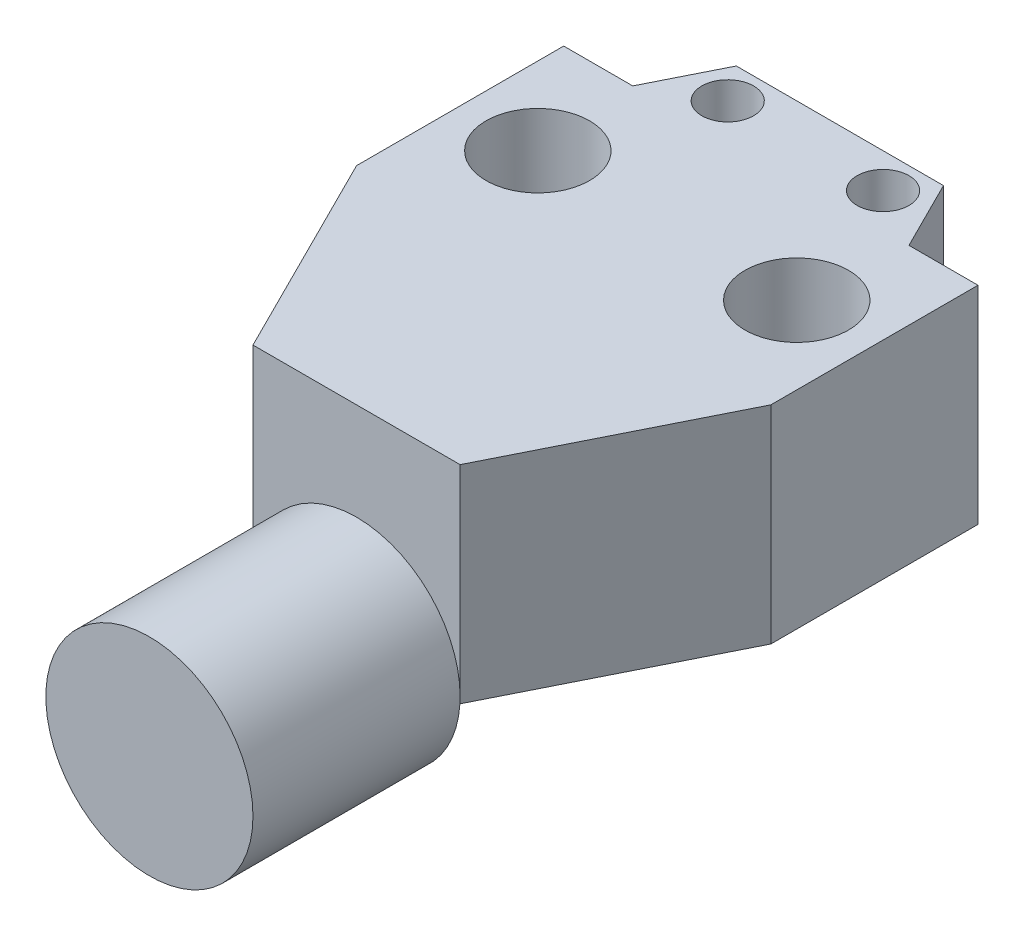
ISO-10303-21;
HEADER;
FILE_DESCRIPTION(('STEP AP214'),'2;1');
FILE_NAME('part.step','',(''),(''),'','','');
FILE_SCHEMA(('AUTOMOTIVE_DESIGN { 1 0 10303 214 1 1 1 1 }'));
ENDSEC;
DATA;
#1=APPLICATION_CONTEXT('core data for automotive mechanical design processes');
#2=APPLICATION_PROTOCOL_DEFINITION('international standard','automotive_design',2000,#1);
#3=PRODUCT_CONTEXT('',#1,'mechanical');
#4=PRODUCT('Part','Part','',(#3));
#5=PRODUCT_RELATED_PRODUCT_CATEGORY('part','',(#4));
#6=PRODUCT_DEFINITION_FORMATION('','',#4);
#7=PRODUCT_DEFINITION_CONTEXT('part definition',#1,'design');
#8=PRODUCT_DEFINITION('design','',#6,#7);
#9=PRODUCT_DEFINITION_SHAPE('','',#8);
#10=(LENGTH_UNIT() NAMED_UNIT(*) SI_UNIT(.MILLI.,.METRE.));
#11=(NAMED_UNIT(*) PLANE_ANGLE_UNIT() SI_UNIT($,.RADIAN.));
#12=(NAMED_UNIT(*) SI_UNIT($,.STERADIAN.) SOLID_ANGLE_UNIT());
#13=UNCERTAINTY_MEASURE_WITH_UNIT(LENGTH_MEASURE(1.E-05),#10,'distance_accuracy_value','');
#14=(GEOMETRIC_REPRESENTATION_CONTEXT(3) GLOBAL_UNCERTAINTY_ASSIGNED_CONTEXT((#13)) GLOBAL_UNIT_ASSIGNED_CONTEXT((#10,
#11,#12)) REPRESENTATION_CONTEXT('',''));
#15=CARTESIAN_POINT('',(0.,0.,0.));
#16=DIRECTION('',(0.,0.,1.));
#17=DIRECTION('',(1.,0.,0.));
#18=AXIS2_PLACEMENT_3D('',#15,#16,#17);
#19=CARTESIAN_POINT('',(-79.375,158.75,238.125));
#20=DIRECTION('',(0.,0.,-1.));
#21=DIRECTION('',(-1.,0.,0.));
#22=AXIS2_PLACEMENT_3D('',#19,#20,#21);
#23=PLANE('',#22);
#24=CARTESIAN_POINT('',(0.,4.84230637468058,238.125));
#25=DIRECTION('',(0.,0.,1.));
#26=DIRECTION('',(1.,0.,0.));
#27=AXIS2_PLACEMENT_3D('',#24,#25,#26);
#28=CIRCLE('',#27,79.375);
#29=CARTESIAN_POINT('',(-79.375,4.84230637468058,238.125));
#30=VERTEX_POINT('',#29);
#31=CARTESIAN_POINT('',(-79.2271588154827,0.,238.125));
#32=VERTEX_POINT('',#31);
#33=EDGE_CURVE('E11',#30,#32,#28,.T.);
#34=ORIENTED_EDGE('',*,*,#33,.F.);
#35=DIRECTION('',(0.,-1.,0.));
#36=VECTOR('',#35,1.);
#37=CARTESIAN_POINT('',(-79.375,158.75,238.125));
#38=LINE('',#37,#36);
#39=CARTESIAN_POINT('',(-79.375,0.,238.125));
#40=VERTEX_POINT('',#39);
#41=EDGE_CURVE('E141',#30,#40,#38,.T.);
#42=ORIENTED_EDGE('',*,*,#41,.T.);
#43=DIRECTION('',(1.,0.,0.));
#44=VECTOR('',#43,1.);
#45=CARTESIAN_POINT('',(-79.375,0.,238.125));
#46=LINE('',#45,#44);
#47=EDGE_CURVE('E254',#40,#32,#46,.T.);
#48=ORIENTED_EDGE('',*,*,#47,.T.);
#49=EDGE_LOOP('',(#34,#42,#48));
#50=FACE_BOUND('',#49,.T.);
#51=ADVANCED_FACE('F39',(#50),#23,.F.);
#52=CARTESIAN_POINT('',(79.375,4.84230637468058,238.125));
#53=VERTEX_POINT('',#52);
#54=EDGE_CURVE('E150',#53,#30,#28,.T.);
#55=ORIENTED_EDGE('',*,*,#54,.F.);
#56=DIRECTION('',(0.,-1.,0.));
#57=VECTOR('',#56,1.);
#58=CARTESIAN_POINT('',(79.375,158.75,238.125));
#59=LINE('',#58,#57);
#60=CARTESIAN_POINT('',(79.375,158.75,238.125));
#61=VERTEX_POINT('',#60);
#62=EDGE_CURVE('E132',#61,#53,#59,.T.);
#63=ORIENTED_EDGE('',*,*,#62,.F.);
#64=DIRECTION('',(1.,0.,0.));
#65=VECTOR('',#64,1.);
#66=CARTESIAN_POINT('',(-79.375,158.75,238.125));
#67=LINE('',#66,#65);
#68=CARTESIAN_POINT('',(-79.375,158.75,238.125));
#69=VERTEX_POINT('',#68);
#70=EDGE_CURVE('E222',#69,#61,#67,.T.);
#71=ORIENTED_EDGE('',*,*,#70,.F.);
#72=EDGE_CURVE('E153',#69,#30,#38,.T.);
#73=ORIENTED_EDGE('',*,*,#72,.T.);
#74=EDGE_LOOP('',(#55,#63,#71,#73));
#75=FACE_BOUND('',#74,.T.);
#76=ADVANCED_FACE('F151',(#75),#23,.F.);
#77=CARTESIAN_POINT('',(0.,158.75,0.));
#78=DIRECTION('',(0.,1.,0.));
#79=DIRECTION('',(0.,0.,1.));
#80=AXIS2_PLACEMENT_3D('',#77,#78,#79);
#81=PLANE('',#80);
#82=CARTESIAN_POINT('',(-59.53125,158.75,-105.833333333333));
#83=DIRECTION('',(0.,1.,0.));
#84=DIRECTION('',(0.,0.,1.));
#85=AXIS2_PLACEMENT_3D('',#82,#83,#84);
#86=CIRCLE('',#85,19.84375);
#87=CARTESIAN_POINT('',(-59.53125,158.75,-125.677083333333));
#88=VERTEX_POINT('',#87);
#89=EDGE_CURVE('E175',#88,#88,#86,.T.);
#90=ORIENTED_EDGE('',*,*,#89,.F.);
#91=EDGE_LOOP('',(#90));
#92=FACE_BOUND('',#91,.T.);
#93=CARTESIAN_POINT('',(-99.21875,158.75,0.));
#94=DIRECTION('',(0.,1.,0.));
#95=DIRECTION('',(0.,0.,1.));
#96=AXIS2_PLACEMENT_3D('',#93,#94,#95);
#97=CIRCLE('',#96,39.6875);
#98=CARTESIAN_POINT('',(-99.21875,158.75,-39.6875));
#99=VERTEX_POINT('',#98);
#100=EDGE_CURVE('E191',#99,#99,#97,.T.);
#101=ORIENTED_EDGE('',*,*,#100,.F.);
#102=EDGE_LOOP('',(#101));
#103=FACE_BOUND('',#102,.T.);
#104=DIRECTION('',(-1.,0.,0.));
#105=VECTOR('',#104,1.);
#106=CARTESIAN_POINT('',(105.833333333333,158.75,-79.375));
#107=LINE('',#106,#105);
#108=CARTESIAN_POINT('',(158.75,158.75,-79.375));
#109=VERTEX_POINT('',#108);
#110=CARTESIAN_POINT('',(105.833333333333,158.75,-79.375));
#111=VERTEX_POINT('',#110);
#112=EDGE_CURVE('E199',#109,#111,#107,.T.);
#113=ORIENTED_EDGE('',*,*,#112,.T.);
#114=DIRECTION('',(-0.447213595499958,0.,-0.894427190999916));
#115=VECTOR('',#114,1.);
#116=CARTESIAN_POINT('',(79.375,158.75,-132.291666666667));
#117=LINE('',#116,#115);
#118=CARTESIAN_POINT('',(79.375,158.75,-132.291666666667));
#119=VERTEX_POINT('',#118);
#120=EDGE_CURVE('E203',#111,#119,#117,.T.);
#121=ORIENTED_EDGE('',*,*,#120,.T.);
#122=DIRECTION('',(-1.,0.,0.));
#123=VECTOR('',#122,1.);
#124=CARTESIAN_POINT('',(79.375,158.75,-132.291666666667));
#125=LINE('',#124,#123);
#126=CARTESIAN_POINT('',(-79.375,158.75,-132.291666666667));
#127=VERTEX_POINT('',#126);
#128=EDGE_CURVE('E207',#119,#127,#125,.T.);
#129=ORIENTED_EDGE('',*,*,#128,.T.);
#130=DIRECTION('',(-0.447213595499959,0.,0.894427190999915));
#131=VECTOR('',#130,1.);
#132=CARTESIAN_POINT('',(-105.833333333333,158.75,-79.375));
#133=LINE('',#132,#131);
#134=CARTESIAN_POINT('',(-105.833333333333,158.75,-79.375));
#135=VERTEX_POINT('',#134);
#136=EDGE_CURVE('E210',#127,#135,#133,.T.);
#137=ORIENTED_EDGE('',*,*,#136,.T.);
#138=DIRECTION('',(-1.,0.,0.));
#139=VECTOR('',#138,1.);
#140=CARTESIAN_POINT('',(-158.75,158.75,-79.375));
#141=LINE('',#140,#139);
#142=CARTESIAN_POINT('',(-158.75,158.75,-79.375));
#143=VERTEX_POINT('',#142);
#144=EDGE_CURVE('E213',#135,#143,#141,.T.);
#145=ORIENTED_EDGE('',*,*,#144,.T.);
#146=DIRECTION('',(0.,0.,1.));
#147=VECTOR('',#146,1.);
#148=CARTESIAN_POINT('',(-158.75,158.75,79.375));
#149=LINE('',#148,#147);
#150=CARTESIAN_POINT('',(-158.75,158.75,79.375));
#151=VERTEX_POINT('',#150);
#152=EDGE_CURVE('E216',#143,#151,#149,.T.);
#153=ORIENTED_EDGE('',*,*,#152,.T.);
#154=DIRECTION('',(0.447213595499958,0.,0.894427190999916));
#155=VECTOR('',#154,1.);
#156=CARTESIAN_POINT('',(-158.75,158.75,79.375));
#157=LINE('',#156,#155);
#158=EDGE_CURVE('E219',#151,#69,#157,.T.);
#159=ORIENTED_EDGE('',*,*,#158,.T.);
#160=ORIENTED_EDGE('',*,*,#70,.T.);
#161=DIRECTION('',(0.447213595499958,0.,-0.894427190999916));
#162=VECTOR('',#161,1.);
#163=CARTESIAN_POINT('',(158.75,158.75,79.375));
#164=LINE('',#163,#162);
#165=CARTESIAN_POINT('',(158.75,158.75,79.375));
#166=VERTEX_POINT('',#165);
#167=EDGE_CURVE('E136',#61,#166,#164,.T.);
#168=ORIENTED_EDGE('',*,*,#167,.T.);
#169=DIRECTION('',(0.,0.,-1.));
#170=VECTOR('',#169,1.);
#171=CARTESIAN_POINT('',(158.75,158.75,79.375));
#172=LINE('',#171,#170);
#173=EDGE_CURVE('E227',#166,#109,#172,.T.);
#174=ORIENTED_EDGE('',*,*,#173,.T.);
#175=EDGE_LOOP('',(#113,#121,#129,#137,#145,#153,#159,#160,#168,#174));
#176=FACE_BOUND('',#175,.T.);
#177=CARTESIAN_POINT('',(99.21875,158.75,0.));
#178=DIRECTION('',(0.,1.,0.));
#179=DIRECTION('',(0.,0.,1.));
#180=AXIS2_PLACEMENT_3D('',#177,#178,#179);
#181=CIRCLE('',#180,39.6875);
#182=CARTESIAN_POINT('',(99.21875,158.75,-39.6875));
#183=VERTEX_POINT('',#182);
#184=EDGE_CURVE('E183',#183,#183,#181,.T.);
#185=ORIENTED_EDGE('',*,*,#184,.F.);
#186=EDGE_LOOP('',(#185));
#187=FACE_BOUND('',#186,.T.);
#188=CARTESIAN_POINT('',(59.53125,158.75,-105.833333333333));
#189=DIRECTION('',(0.,1.,0.));
#190=DIRECTION('',(0.,0.,1.));
#191=AXIS2_PLACEMENT_3D('',#188,#189,#190);
#192=CIRCLE('',#191,19.84375);
#193=CARTESIAN_POINT('',(59.53125,158.75,-125.677083333333));
#194=VERTEX_POINT('',#193);
#195=EDGE_CURVE('E166',#194,#194,#192,.T.);
#196=ORIENTED_EDGE('',*,*,#195,.F.);
#197=EDGE_LOOP('',(#196));
#198=FACE_BOUND('',#197,.T.);
#199=ADVANCED_FACE('F314',(#92,#103,#176,#187,#198),#81,.T.);
#200=CARTESIAN_POINT('',(0.,0.,0.));
#201=DIRECTION('',(0.,1.,0.));
#202=DIRECTION('',(0.,0.,1.));
#203=AXIS2_PLACEMENT_3D('',#200,#201,#202);
#204=PLANE('',#203);
#205=DIRECTION('',(-1.,0.,0.));
#206=VECTOR('',#205,1.);
#207=CARTESIAN_POINT('',(105.833333333333,0.,-79.375));
#208=LINE('',#207,#206);
#209=CARTESIAN_POINT('',(158.75,0.,-79.375));
#210=VERTEX_POINT('',#209);
#211=CARTESIAN_POINT('',(105.833333333333,0.,-79.375));
#212=VERTEX_POINT('',#211);
#213=EDGE_CURVE('E195',#210,#212,#208,.T.);
#214=ORIENTED_EDGE('',*,*,#213,.F.);
#215=DIRECTION('',(0.,0.,-1.));
#216=VECTOR('',#215,1.);
#217=CARTESIAN_POINT('',(158.75,0.,79.375));
#218=LINE('',#217,#216);
#219=CARTESIAN_POINT('',(158.75,0.,79.375));
#220=VERTEX_POINT('',#219);
#221=EDGE_CURVE('E204',#220,#210,#218,.T.);
#222=ORIENTED_EDGE('',*,*,#221,.F.);
#223=DIRECTION('',(0.447213595499958,0.,-0.894427190999916));
#224=VECTOR('',#223,1.);
#225=CARTESIAN_POINT('',(158.75,0.,79.375));
#226=LINE('',#225,#224);
#227=CARTESIAN_POINT('',(79.375,0.,238.125));
#228=VERTEX_POINT('',#227);
#229=EDGE_CURVE('E257',#228,#220,#226,.T.);
#230=ORIENTED_EDGE('',*,*,#229,.F.);
#231=CARTESIAN_POINT('',(79.2271588154827,0.,238.125));
#232=VERTEX_POINT('',#231);
#233=EDGE_CURVE('E144',#232,#228,#46,.T.);
#234=ORIENTED_EDGE('',*,*,#233,.F.);
#235=EDGE_CURVE('E258',#32,#232,#46,.T.);
#236=ORIENTED_EDGE('',*,*,#235,.F.);
#237=ORIENTED_EDGE('',*,*,#47,.F.);
#238=DIRECTION('',(0.447213595499958,0.,0.894427190999916));
#239=VECTOR('',#238,1.);
#240=CARTESIAN_POINT('',(-158.75,0.,79.375));
#241=LINE('',#240,#239);
#242=CARTESIAN_POINT('',(-158.75,0.,79.375));
#243=VERTEX_POINT('',#242);
#244=EDGE_CURVE('E250',#243,#40,#241,.T.);
#245=ORIENTED_EDGE('',*,*,#244,.F.);
#246=DIRECTION('',(0.,0.,1.));
#247=VECTOR('',#246,1.);
#248=CARTESIAN_POINT('',(-158.75,0.,79.375));
#249=LINE('',#248,#247);
#250=CARTESIAN_POINT('',(-158.75,0.,-79.375));
#251=VERTEX_POINT('',#250);
#252=EDGE_CURVE('E247',#251,#243,#249,.T.);
#253=ORIENTED_EDGE('',*,*,#252,.F.);
#254=DIRECTION('',(-1.,0.,0.));
#255=VECTOR('',#254,1.);
#256=CARTESIAN_POINT('',(-158.75,0.,-79.375));
#257=LINE('',#256,#255);
#258=CARTESIAN_POINT('',(-105.833333333333,0.,-79.375));
#259=VERTEX_POINT('',#258);
#260=EDGE_CURVE('E244',#259,#251,#257,.T.);
#261=ORIENTED_EDGE('',*,*,#260,.F.);
#262=DIRECTION('',(-0.447213595499959,0.,0.894427190999915));
#263=VECTOR('',#262,1.);
#264=CARTESIAN_POINT('',(-105.833333333333,0.,-79.375));
#265=LINE('',#264,#263);
#266=CARTESIAN_POINT('',(-79.375,0.,-132.291666666667));
#267=VERTEX_POINT('',#266);
#268=EDGE_CURVE('E241',#267,#259,#265,.T.);
#269=ORIENTED_EDGE('',*,*,#268,.F.);
#270=DIRECTION('',(-1.,0.,0.));
#271=VECTOR('',#270,1.);
#272=CARTESIAN_POINT('',(0.,0.,-132.291666666667));
#273=LINE('',#272,#271);
#274=CARTESIAN_POINT('',(79.375,0.,-132.291666666667));
#275=VERTEX_POINT('',#274);
#276=EDGE_CURVE('E238',#275,#267,#273,.T.);
#277=ORIENTED_EDGE('',*,*,#276,.F.);
#278=DIRECTION('',(-0.447213595499958,0.,-0.894427190999916));
#279=VECTOR('',#278,1.);
#280=CARTESIAN_POINT('',(79.375,0.,-132.291666666667));
#281=LINE('',#280,#279);
#282=EDGE_CURVE('E234',#212,#275,#281,.T.);
#283=ORIENTED_EDGE('',*,*,#282,.F.);
#284=EDGE_LOOP('',(#214,#222,#230,#234,#236,#237,#245,#253,#261,#269,#277,#283));
#285=FACE_BOUND('',#284,.T.);
#286=CARTESIAN_POINT('',(-99.21875,0.,0.));
#287=DIRECTION('',(0.,1.,0.));
#288=DIRECTION('',(0.,0.,1.));
#289=AXIS2_PLACEMENT_3D('',#286,#287,#288);
#290=CIRCLE('',#289,39.6875);
#291=CARTESIAN_POINT('',(-99.21875,0.,-39.6875));
#292=VERTEX_POINT('',#291);
#293=EDGE_CURVE('E187',#292,#292,#290,.T.);
#294=ORIENTED_EDGE('',*,*,#293,.T.);
#295=EDGE_LOOP('',(#294));
#296=FACE_BOUND('',#295,.T.);
#297=CARTESIAN_POINT('',(99.21875,0.,0.));
#298=DIRECTION('',(0.,1.,0.));
#299=DIRECTION('',(0.,0.,1.));
#300=AXIS2_PLACEMENT_3D('',#297,#298,#299);
#301=CIRCLE('',#300,39.6875);
#302=CARTESIAN_POINT('',(99.21875,0.,-39.6875));
#303=VERTEX_POINT('',#302);
#304=EDGE_CURVE('E179',#303,#303,#301,.T.);
#305=ORIENTED_EDGE('',*,*,#304,.T.);
#306=EDGE_LOOP('',(#305));
#307=FACE_BOUND('',#306,.T.);
#308=CARTESIAN_POINT('',(-59.53125,0.,-105.833333333333));
#309=DIRECTION('',(0.,1.,0.));
#310=DIRECTION('',(0.,0.,1.));
#311=AXIS2_PLACEMENT_3D('',#308,#309,#310);
#312=CIRCLE('',#311,19.84375);
#313=CARTESIAN_POINT('',(-59.53125,0.,-125.677083333333));
#314=VERTEX_POINT('',#313);
#315=EDGE_CURVE('E170',#314,#314,#312,.T.);
#316=ORIENTED_EDGE('',*,*,#315,.T.);
#317=EDGE_LOOP('',(#316));
#318=FACE_BOUND('',#317,.T.);
#319=CARTESIAN_POINT('',(59.53125,0.,-105.833333333333));
#320=DIRECTION('',(0.,1.,0.));
#321=DIRECTION('',(0.,0.,1.));
#322=AXIS2_PLACEMENT_3D('',#319,#320,#321);
#323=CIRCLE('',#322,19.84375);
#324=CARTESIAN_POINT('',(59.53125,0.,-125.677083333333));
#325=VERTEX_POINT('',#324);
#326=EDGE_CURVE('E171',#325,#325,#323,.T.);
#327=ORIENTED_EDGE('',*,*,#326,.T.);
#328=EDGE_LOOP('',(#327));
#329=FACE_BOUND('',#328,.T.);
#330=ADVANCED_FACE('F298',(#285,#296,#307,#318,#329),#204,.F.);
#331=CARTESIAN_POINT('',(105.833333333333,158.75,-79.375));
#332=DIRECTION('',(0.,0.,1.));
#333=DIRECTION('',(1.,0.,0.));
#334=AXIS2_PLACEMENT_3D('',#331,#332,#333);
#335=PLANE('',#334);
#336=ORIENTED_EDGE('',*,*,#213,.T.);
#337=DIRECTION('',(0.,-1.,0.));
#338=VECTOR('',#337,1.);
#339=CARTESIAN_POINT('',(105.833333333333,158.75,-79.375));
#340=LINE('',#339,#338);
#341=EDGE_CURVE('E43',#111,#212,#340,.T.);
#342=ORIENTED_EDGE('',*,*,#341,.F.);
#343=ORIENTED_EDGE('',*,*,#112,.F.);
#344=DIRECTION('',(0.,-1.,0.));
#345=VECTOR('',#344,1.);
#346=CARTESIAN_POINT('',(158.75,158.75,-79.375));
#347=LINE('',#346,#345);
#348=EDGE_CURVE('E230',#109,#210,#347,.T.);
#349=ORIENTED_EDGE('',*,*,#348,.T.);
#350=EDGE_LOOP('',(#336,#342,#343,#349));
#351=FACE_BOUND('',#350,.T.);
#352=ADVANCED_FACE('F41',(#351),#335,.F.);
#353=CARTESIAN_POINT('',(79.375,158.75,-132.291666666667));
#354=DIRECTION('',(-0.894427190999916,0.,0.447213595499958));
#355=DIRECTION('',(0.447213595499958,0.,0.894427190999916));
#356=AXIS2_PLACEMENT_3D('',#353,#354,#355);
#357=PLANE('',#356);
#358=ORIENTED_EDGE('',*,*,#282,.T.);
#359=DIRECTION('',(0.,-1.,0.));
#360=VECTOR('',#359,1.);
#361=CARTESIAN_POINT('',(79.375,158.75,-132.291666666667));
#362=LINE('',#361,#360);
#363=EDGE_CURVE('E163',#119,#275,#362,.T.);
#364=ORIENTED_EDGE('',*,*,#363,.F.);
#365=ORIENTED_EDGE('',*,*,#120,.F.);
#366=ORIENTED_EDGE('',*,*,#341,.T.);
#367=EDGE_LOOP('',(#358,#364,#365,#366));
#368=FACE_BOUND('',#367,.T.);
#369=ADVANCED_FACE('F294',(#368),#357,.F.);
#370=CARTESIAN_POINT('',(0.,158.75,-132.291666666667));
#371=DIRECTION('',(0.,0.,1.));
#372=DIRECTION('',(1.,0.,0.));
#373=AXIS2_PLACEMENT_3D('',#370,#371,#372);
#374=PLANE('',#373);
#375=ORIENTED_EDGE('',*,*,#276,.T.);
#376=DIRECTION('',(0.,-1.,0.));
#377=VECTOR('',#376,1.);
#378=CARTESIAN_POINT('',(-79.375,158.75,-132.291666666667));
#379=LINE('',#378,#377);
#380=EDGE_CURVE('E283',#127,#267,#379,.T.);
#381=ORIENTED_EDGE('',*,*,#380,.F.);
#382=ORIENTED_EDGE('',*,*,#128,.F.);
#383=ORIENTED_EDGE('',*,*,#363,.T.);
#384=EDGE_LOOP('',(#375,#381,#382,#383));
#385=FACE_BOUND('',#384,.T.);
#386=ADVANCED_FACE('F291',(#385),#374,.F.);
#387=CARTESIAN_POINT('',(-105.833333333333,158.75,-79.375));
#388=DIRECTION('',(0.894427190999915,0.,0.447213595499959));
#389=DIRECTION('',(0.447213595499959,0.,-0.894427190999916));
#390=AXIS2_PLACEMENT_3D('',#387,#388,#389);
#391=PLANE('',#390);
#392=ORIENTED_EDGE('',*,*,#268,.T.);
#393=DIRECTION('',(0.,-1.,0.));
#394=VECTOR('',#393,1.);
#395=CARTESIAN_POINT('',(-105.833333333333,158.75,-79.375));
#396=LINE('',#395,#394);
#397=EDGE_CURVE('E279',#135,#259,#396,.T.);
#398=ORIENTED_EDGE('',*,*,#397,.F.);
#399=ORIENTED_EDGE('',*,*,#136,.F.);
#400=ORIENTED_EDGE('',*,*,#380,.T.);
#401=EDGE_LOOP('',(#392,#398,#399,#400));
#402=FACE_BOUND('',#401,.T.);
#403=ADVANCED_FACE('F306',(#402),#391,.F.);
#404=CARTESIAN_POINT('',(-158.75,158.75,-79.375));
#405=DIRECTION('',(0.,0.,1.));
#406=DIRECTION('',(1.,0.,0.));
#407=AXIS2_PLACEMENT_3D('',#404,#405,#406);
#408=PLANE('',#407);
#409=ORIENTED_EDGE('',*,*,#260,.T.);
#410=DIRECTION('',(0.,-1.,0.));
#411=VECTOR('',#410,1.);
#412=CARTESIAN_POINT('',(-158.75,158.75,-79.375));
#413=LINE('',#412,#411);
#414=EDGE_CURVE('E275',#143,#251,#413,.T.);
#415=ORIENTED_EDGE('',*,*,#414,.F.);
#416=ORIENTED_EDGE('',*,*,#144,.F.);
#417=ORIENTED_EDGE('',*,*,#397,.T.);
#418=EDGE_LOOP('',(#409,#415,#416,#417));
#419=FACE_BOUND('',#418,.T.);
#420=ADVANCED_FACE('F310',(#419),#408,.F.);
#421=CARTESIAN_POINT('',(-158.75,158.75,79.375));
#422=DIRECTION('',(1.,0.,0.));
#423=DIRECTION('',(0.,0.,-1.));
#424=AXIS2_PLACEMENT_3D('',#421,#422,#423);
#425=PLANE('',#424);
#426=ORIENTED_EDGE('',*,*,#252,.T.);
#427=DIRECTION('',(0.,-1.,0.));
#428=VECTOR('',#427,1.);
#429=CARTESIAN_POINT('',(-158.75,158.75,79.375));
#430=LINE('',#429,#428);
#431=EDGE_CURVE('E271',#151,#243,#430,.T.);
#432=ORIENTED_EDGE('',*,*,#431,.F.);
#433=ORIENTED_EDGE('',*,*,#152,.F.);
#434=ORIENTED_EDGE('',*,*,#414,.T.);
#435=EDGE_LOOP('',(#426,#432,#433,#434));
#436=FACE_BOUND('',#435,.T.);
#437=ADVANCED_FACE('F359',(#436),#425,.F.);
#438=CARTESIAN_POINT('',(-158.75,158.75,79.375));
#439=DIRECTION('',(0.894427190999916,0.,-0.447213595499958));
#440=DIRECTION('',(-0.447213595499958,0.,-0.894427190999916));
#441=AXIS2_PLACEMENT_3D('',#438,#439,#440);
#442=PLANE('',#441);
#443=ORIENTED_EDGE('',*,*,#244,.T.);
#444=ORIENTED_EDGE('',*,*,#41,.F.);
#445=ORIENTED_EDGE('',*,*,#72,.F.);
#446=ORIENTED_EDGE('',*,*,#158,.F.);
#447=ORIENTED_EDGE('',*,*,#431,.T.);
#448=EDGE_LOOP('',(#443,#444,#445,#446,#447));
#449=FACE_BOUND('',#448,.T.);
#450=ADVANCED_FACE('F354',(#449),#442,.F.);
#451=EDGE_CURVE('E49',#232,#53,#28,.T.);
#452=ORIENTED_EDGE('',*,*,#451,.F.);
#453=ORIENTED_EDGE('',*,*,#233,.T.);
#454=EDGE_CURVE('E134',#53,#228,#59,.T.);
#455=ORIENTED_EDGE('',*,*,#454,.F.);
#456=EDGE_LOOP('',(#452,#453,#455));
#457=FACE_BOUND('',#456,.T.);
#458=ADVANCED_FACE('F143',(#457),#23,.F.);
#459=CARTESIAN_POINT('',(158.75,158.75,79.375));
#460=DIRECTION('',(-0.894427190999916,0.,-0.447213595499958));
#461=DIRECTION('',(-0.447213595499958,0.,0.894427190999916));
#462=AXIS2_PLACEMENT_3D('',#459,#460,#461);
#463=PLANE('',#462);
#464=ORIENTED_EDGE('',*,*,#229,.T.);
#465=DIRECTION('',(0.,-1.,0.));
#466=VECTOR('',#465,1.);
#467=CARTESIAN_POINT('',(158.75,158.75,79.375));
#468=LINE('',#467,#466);
#469=EDGE_CURVE('E147',#166,#220,#468,.T.);
#470=ORIENTED_EDGE('',*,*,#469,.F.);
#471=ORIENTED_EDGE('',*,*,#167,.F.);
#472=ORIENTED_EDGE('',*,*,#62,.T.);
#473=ORIENTED_EDGE('',*,*,#454,.T.);
#474=EDGE_LOOP('',(#464,#470,#471,#472,#473));
#475=FACE_BOUND('',#474,.T.);
#476=ADVANCED_FACE('F133',(#475),#463,.F.);
#477=CARTESIAN_POINT('',(158.75,158.75,79.375));
#478=DIRECTION('',(-1.,0.,0.));
#479=DIRECTION('',(0.,0.,1.));
#480=AXIS2_PLACEMENT_3D('',#477,#478,#479);
#481=PLANE('',#480);
#482=ORIENTED_EDGE('',*,*,#221,.T.);
#483=ORIENTED_EDGE('',*,*,#348,.F.);
#484=ORIENTED_EDGE('',*,*,#173,.F.);
#485=ORIENTED_EDGE('',*,*,#469,.T.);
#486=EDGE_LOOP('',(#482,#483,#484,#485));
#487=FACE_BOUND('',#486,.T.);
#488=ADVANCED_FACE('F322',(#487),#481,.F.);
#489=CARTESIAN_POINT('',(-99.21875,158.75,0.));
#490=DIRECTION('',(0.,-1.,0.));
#491=DIRECTION('',(0.,0.,-1.));
#492=AXIS2_PLACEMENT_3D('',#489,#490,#491);
#493=CYLINDRICAL_SURFACE('',#492,39.6875);
#494=CARTESIAN_POINT('',(-99.21875,158.75,-39.6875));
#495=CARTESIAN_POINT('',(-99.21875,157.096354166667,-39.6875));
#496=CARTESIAN_POINT('',(-99.21875,155.442708333333,-39.6875));
#497=CARTESIAN_POINT('',(-99.21875,152.135416666667,-39.6875));
#498=CARTESIAN_POINT('',(-99.21875,150.481770833333,-39.6875));
#499=CARTESIAN_POINT('',(-99.21875,147.174479166667,-39.6875));
#500=CARTESIAN_POINT('',(-99.21875,145.520833333333,-39.6875));
#501=CARTESIAN_POINT('',(-99.21875,142.213541666667,-39.6875));
#502=CARTESIAN_POINT('',(-99.21875,140.559895833333,-39.6875));
#503=CARTESIAN_POINT('',(-99.21875,137.252604166667,-39.6875));
#504=CARTESIAN_POINT('',(-99.21875,135.598958333333,-39.6875));
#505=CARTESIAN_POINT('',(-99.21875,132.291666666667,-39.6875));
#506=CARTESIAN_POINT('',(-99.21875,130.638020833333,-39.6875));
#507=CARTESIAN_POINT('',(-99.21875,127.330729166667,-39.6875));
#508=CARTESIAN_POINT('',(-99.21875,125.677083333333,-39.6875));
#509=CARTESIAN_POINT('',(-99.21875,122.369791666667,-39.6875));
#510=CARTESIAN_POINT('',(-99.21875,120.716145833333,-39.6875));
#511=CARTESIAN_POINT('',(-99.21875,117.408854166667,-39.6875));
#512=CARTESIAN_POINT('',(-99.21875,115.755208333333,-39.6875));
#513=CARTESIAN_POINT('',(-99.21875,112.447916666667,-39.6875));
#514=CARTESIAN_POINT('',(-99.21875,110.794270833333,-39.6875));
#515=CARTESIAN_POINT('',(-99.21875,107.486979166667,-39.6875));
#516=CARTESIAN_POINT('',(-99.21875,105.833333333333,-39.6875));
#517=CARTESIAN_POINT('',(-99.21875,102.526041666667,-39.6875));
#518=CARTESIAN_POINT('',(-99.21875,100.872395833333,-39.6875));
#519=CARTESIAN_POINT('',(-99.21875,97.5651041666666,-39.6875));
#520=CARTESIAN_POINT('',(-99.21875,95.9114583333333,-39.6875));
#521=CARTESIAN_POINT('',(-99.21875,92.6041666666666,-39.6875));
#522=CARTESIAN_POINT('',(-99.21875,90.9505208333333,-39.6875));
#523=CARTESIAN_POINT('',(-99.21875,87.6432291666666,-39.6875));
#524=CARTESIAN_POINT('',(-99.21875,85.9895833333333,-39.6875));
#525=CARTESIAN_POINT('',(-99.21875,82.6822916666666,-39.6875));
#526=CARTESIAN_POINT('',(-99.21875,81.0286458333333,-39.6875));
#527=CARTESIAN_POINT('',(-99.21875,77.7213541666666,-39.6875));
#528=CARTESIAN_POINT('',(-99.21875,76.0677083333333,-39.6875));
#529=CARTESIAN_POINT('',(-99.21875,72.7604166666666,-39.6875));
#530=CARTESIAN_POINT('',(-99.21875,71.1067708333333,-39.6875));
#531=CARTESIAN_POINT('',(-99.21875,67.7994791666666,-39.6875));
#532=CARTESIAN_POINT('',(-99.21875,66.1458333333333,-39.6875));
#533=CARTESIAN_POINT('',(-99.21875,62.8385416666666,-39.6875));
#534=CARTESIAN_POINT('',(-99.21875,61.1848958333333,-39.6875));
#535=CARTESIAN_POINT('',(-99.21875,57.8776041666666,-39.6875));
#536=CARTESIAN_POINT('',(-99.21875,56.2239583333333,-39.6875));
#537=CARTESIAN_POINT('',(-99.21875,52.9166666666666,-39.6875));
#538=CARTESIAN_POINT('',(-99.21875,51.2630208333333,-39.6875));
#539=CARTESIAN_POINT('',(-99.21875,47.9557291666666,-39.6875));
#540=CARTESIAN_POINT('',(-99.21875,46.3020833333333,-39.6875));
#541=CARTESIAN_POINT('',(-99.21875,42.9947916666666,-39.6875));
#542=CARTESIAN_POINT('',(-99.21875,41.3411458333333,-39.6875));
#543=CARTESIAN_POINT('',(-99.21875,38.0338541666666,-39.6875));
#544=CARTESIAN_POINT('',(-99.21875,36.3802083333333,-39.6875));
#545=CARTESIAN_POINT('',(-99.21875,33.0729166666666,-39.6875));
#546=CARTESIAN_POINT('',(-99.21875,31.4192708333333,-39.6875));
#547=CARTESIAN_POINT('',(-99.21875,28.1119791666667,-39.6875));
#548=CARTESIAN_POINT('',(-99.21875,26.4583333333333,-39.6875));
#549=CARTESIAN_POINT('',(-99.21875,23.1510416666666,-39.6875));
#550=CARTESIAN_POINT('',(-99.21875,21.4973958333333,-39.6875));
#551=CARTESIAN_POINT('',(-99.21875,18.1901041666666,-39.6875));
#552=CARTESIAN_POINT('',(-99.21875,16.5364583333333,-39.6875));
#553=CARTESIAN_POINT('',(-99.21875,13.2291666666666,-39.6875));
#554=CARTESIAN_POINT('',(-99.21875,11.5755208333333,-39.6875));
#555=CARTESIAN_POINT('',(-99.21875,8.26822916666664,-39.6875));
#556=CARTESIAN_POINT('',(-99.21875,6.61458333333331,-39.6875));
#557=CARTESIAN_POINT('',(-99.21875,3.30729166666665,-39.6875));
#558=CARTESIAN_POINT('',(-99.21875,1.65364583333331,-39.6875));
#559=CARTESIAN_POINT('',(-99.21875,0.,-39.6875));
#560=B_SPLINE_CURVE_WITH_KNOTS('',3,(#494,#495,#496,#497,#498,#499,#500,#501,#502,#503,#504,
#505,#506,#507,#508,#509,#510,#511,#512,#513,#514,#515,#516,#517,#518,#519,#520,#521,#522,#523,
#524,#525,#526,#527,#528,#529,#530,#531,#532,#533,#534,#535,#536,#537,#538,#539,#540,#541,#542,
#543,#544,#545,#546,#547,#548,#549,#550,#551,#552,#553,#554,#555,#556,#557,#558,#559),
.UNSPECIFIED.,.F.,.F.,(4,2,2,2,2,2,2,2,2,2,2,2,2,2,2,2,2,2,2,2,2,2,2,2,2,2,2,2,2,2,2,2,4),(0.,
4.96093750000001,9.92187500000002,14.8828125,19.84375,24.8046875,29.765625,34.7265625,39.6875,
44.6484375,49.609375,54.5703125,59.53125,64.4921875,69.453125,74.4140625,79.375,84.3359375,
89.296875,94.2578125,99.21875,104.1796875,109.140625,114.1015625,119.0625,124.0234375,
128.984375,133.9453125,138.90625,143.8671875,148.828125,153.7890625,158.75),.UNSPECIFIED.);
#561=EDGE_CURVE('BSEAM388',#99,#292,#560,.T.);
#562=ORIENTED_EDGE('',*,*,#100,.T.);
#563=ORIENTED_EDGE('',*,*,#293,.F.);
#564=ORIENTED_EDGE('',*,*,#561,.T.);
#565=ORIENTED_EDGE('',*,*,#561,.F.);
#566=EDGE_LOOP('',(#562,#564,#563,#565));
#567=FACE_BOUND('',#566,.T.);
#568=ADVANCED_FACE('F388',(#567),#493,.F.);
#569=CARTESIAN_POINT('',(99.21875,158.75,0.));
#570=DIRECTION('',(0.,-1.,0.));
#571=DIRECTION('',(0.,0.,-1.));
#572=AXIS2_PLACEMENT_3D('',#569,#570,#571);
#573=CYLINDRICAL_SURFACE('',#572,39.6875);
#574=CARTESIAN_POINT('',(99.21875,158.75,-39.6875));
#575=CARTESIAN_POINT('',(99.21875,157.096354166667,-39.6875));
#576=CARTESIAN_POINT('',(99.21875,155.442708333333,-39.6875));
#577=CARTESIAN_POINT('',(99.21875,152.135416666667,-39.6875));
#578=CARTESIAN_POINT('',(99.21875,150.481770833333,-39.6875));
#579=CARTESIAN_POINT('',(99.21875,147.174479166667,-39.6875));
#580=CARTESIAN_POINT('',(99.21875,145.520833333333,-39.6875));
#581=CARTESIAN_POINT('',(99.21875,142.213541666667,-39.6875));
#582=CARTESIAN_POINT('',(99.21875,140.559895833333,-39.6875));
#583=CARTESIAN_POINT('',(99.21875,137.252604166667,-39.6875));
#584=CARTESIAN_POINT('',(99.21875,135.598958333333,-39.6875));
#585=CARTESIAN_POINT('',(99.21875,132.291666666667,-39.6875));
#586=CARTESIAN_POINT('',(99.21875,130.638020833333,-39.6875));
#587=CARTESIAN_POINT('',(99.21875,127.330729166667,-39.6875));
#588=CARTESIAN_POINT('',(99.21875,125.677083333333,-39.6875));
#589=CARTESIAN_POINT('',(99.21875,122.369791666667,-39.6875));
#590=CARTESIAN_POINT('',(99.21875,120.716145833333,-39.6875));
#591=CARTESIAN_POINT('',(99.21875,117.408854166667,-39.6875));
#592=CARTESIAN_POINT('',(99.21875,115.755208333333,-39.6875));
#593=CARTESIAN_POINT('',(99.21875,112.447916666667,-39.6875));
#594=CARTESIAN_POINT('',(99.21875,110.794270833333,-39.6875));
#595=CARTESIAN_POINT('',(99.21875,107.486979166667,-39.6875));
#596=CARTESIAN_POINT('',(99.21875,105.833333333333,-39.6875));
#597=CARTESIAN_POINT('',(99.21875,102.526041666667,-39.6875));
#598=CARTESIAN_POINT('',(99.21875,100.872395833333,-39.6875));
#599=CARTESIAN_POINT('',(99.21875,97.5651041666666,-39.6875));
#600=CARTESIAN_POINT('',(99.21875,95.9114583333333,-39.6875));
#601=CARTESIAN_POINT('',(99.21875,92.6041666666666,-39.6875));
#602=CARTESIAN_POINT('',(99.21875,90.9505208333333,-39.6875));
#603=CARTESIAN_POINT('',(99.21875,87.6432291666666,-39.6875));
#604=CARTESIAN_POINT('',(99.21875,85.9895833333333,-39.6875));
#605=CARTESIAN_POINT('',(99.21875,82.6822916666666,-39.6875));
#606=CARTESIAN_POINT('',(99.21875,81.0286458333333,-39.6875));
#607=CARTESIAN_POINT('',(99.21875,77.7213541666666,-39.6875));
#608=CARTESIAN_POINT('',(99.21875,76.0677083333333,-39.6875));
#609=CARTESIAN_POINT('',(99.21875,72.7604166666666,-39.6875));
#610=CARTESIAN_POINT('',(99.21875,71.1067708333333,-39.6875));
#611=CARTESIAN_POINT('',(99.21875,67.7994791666666,-39.6875));
#612=CARTESIAN_POINT('',(99.21875,66.1458333333333,-39.6875));
#613=CARTESIAN_POINT('',(99.21875,62.8385416666666,-39.6875));
#614=CARTESIAN_POINT('',(99.21875,61.1848958333333,-39.6875));
#615=CARTESIAN_POINT('',(99.21875,57.8776041666666,-39.6875));
#616=CARTESIAN_POINT('',(99.21875,56.2239583333333,-39.6875));
#617=CARTESIAN_POINT('',(99.21875,52.9166666666666,-39.6875));
#618=CARTESIAN_POINT('',(99.21875,51.2630208333333,-39.6875));
#619=CARTESIAN_POINT('',(99.21875,47.9557291666666,-39.6875));
#620=CARTESIAN_POINT('',(99.21875,46.3020833333333,-39.6875));
#621=CARTESIAN_POINT('',(99.21875,42.9947916666666,-39.6875));
#622=CARTESIAN_POINT('',(99.21875,41.3411458333333,-39.6875));
#623=CARTESIAN_POINT('',(99.21875,38.0338541666666,-39.6875));
#624=CARTESIAN_POINT('',(99.21875,36.3802083333333,-39.6875));
#625=CARTESIAN_POINT('',(99.21875,33.0729166666666,-39.6875));
#626=CARTESIAN_POINT('',(99.21875,31.4192708333333,-39.6875));
#627=CARTESIAN_POINT('',(99.21875,28.1119791666667,-39.6875));
#628=CARTESIAN_POINT('',(99.21875,26.4583333333333,-39.6875));
#629=CARTESIAN_POINT('',(99.21875,23.1510416666666,-39.6875));
#630=CARTESIAN_POINT('',(99.21875,21.4973958333333,-39.6875));
#631=CARTESIAN_POINT('',(99.21875,18.1901041666666,-39.6875));
#632=CARTESIAN_POINT('',(99.21875,16.5364583333333,-39.6875));
#633=CARTESIAN_POINT('',(99.21875,13.2291666666666,-39.6875));
#634=CARTESIAN_POINT('',(99.21875,11.5755208333333,-39.6875));
#635=CARTESIAN_POINT('',(99.21875,8.26822916666664,-39.6875));
#636=CARTESIAN_POINT('',(99.21875,6.61458333333331,-39.6875));
#637=CARTESIAN_POINT('',(99.21875,3.30729166666665,-39.6875));
#638=CARTESIAN_POINT('',(99.21875,1.65364583333331,-39.6875));
#639=CARTESIAN_POINT('',(99.21875,0.,-39.6875));
#640=B_SPLINE_CURVE_WITH_KNOTS('',3,(#574,#575,#576,#577,#578,#579,#580,#581,#582,#583,#584,
#585,#586,#587,#588,#589,#590,#591,#592,#593,#594,#595,#596,#597,#598,#599,#600,#601,#602,#603,
#604,#605,#606,#607,#608,#609,#610,#611,#612,#613,#614,#615,#616,#617,#618,#619,#620,#621,#622,
#623,#624,#625,#626,#627,#628,#629,#630,#631,#632,#633,#634,#635,#636,#637,#638,#639),
.UNSPECIFIED.,.F.,.F.,(4,2,2,2,2,2,2,2,2,2,2,2,2,2,2,2,2,2,2,2,2,2,2,2,2,2,2,2,2,2,2,2,4),(0.,
4.96093750000001,9.92187500000002,14.8828125,19.84375,24.8046875,29.765625,34.7265625,39.6875,
44.6484375,49.609375,54.5703125,59.53125,64.4921875,69.453125,74.4140625,79.375,84.3359375,
89.296875,94.2578125,99.21875,104.1796875,109.140625,114.1015625,119.0625,124.0234375,
128.984375,133.9453125,138.90625,143.8671875,148.828125,153.7890625,158.75),.UNSPECIFIED.);
#641=EDGE_CURVE('BSEAM392',#183,#303,#640,.T.);
#642=ORIENTED_EDGE('',*,*,#184,.T.);
#643=ORIENTED_EDGE('',*,*,#304,.F.);
#644=ORIENTED_EDGE('',*,*,#641,.T.);
#645=ORIENTED_EDGE('',*,*,#641,.F.);
#646=EDGE_LOOP('',(#642,#644,#643,#645));
#647=FACE_BOUND('',#646,.T.);
#648=ADVANCED_FACE('F392',(#647),#573,.F.);
#649=CARTESIAN_POINT('',(-59.53125,158.75,-105.833333333333));
#650=DIRECTION('',(0.,-1.,0.));
#651=DIRECTION('',(0.,0.,-1.));
#652=AXIS2_PLACEMENT_3D('',#649,#650,#651);
#653=CYLINDRICAL_SURFACE('',#652,19.84375);
#654=CARTESIAN_POINT('',(-59.53125,158.75,-125.677083333333));
#655=CARTESIAN_POINT('',(-59.53125,157.096354166667,-125.677083333333));
#656=CARTESIAN_POINT('',(-59.53125,155.442708333333,-125.677083333333));
#657=CARTESIAN_POINT('',(-59.53125,152.135416666667,-125.677083333333));
#658=CARTESIAN_POINT('',(-59.53125,150.481770833333,-125.677083333333));
#659=CARTESIAN_POINT('',(-59.53125,147.174479166667,-125.677083333333));
#660=CARTESIAN_POINT('',(-59.53125,145.520833333333,-125.677083333333));
#661=CARTESIAN_POINT('',(-59.53125,142.213541666667,-125.677083333333));
#662=CARTESIAN_POINT('',(-59.53125,140.559895833333,-125.677083333333));
#663=CARTESIAN_POINT('',(-59.53125,137.252604166667,-125.677083333333));
#664=CARTESIAN_POINT('',(-59.53125,135.598958333333,-125.677083333333));
#665=CARTESIAN_POINT('',(-59.53125,132.291666666667,-125.677083333333));
#666=CARTESIAN_POINT('',(-59.53125,130.638020833333,-125.677083333333));
#667=CARTESIAN_POINT('',(-59.53125,127.330729166667,-125.677083333333));
#668=CARTESIAN_POINT('',(-59.53125,125.677083333333,-125.677083333333));
#669=CARTESIAN_POINT('',(-59.53125,122.369791666667,-125.677083333333));
#670=CARTESIAN_POINT('',(-59.53125,120.716145833333,-125.677083333333));
#671=CARTESIAN_POINT('',(-59.53125,117.408854166667,-125.677083333333));
#672=CARTESIAN_POINT('',(-59.53125,115.755208333333,-125.677083333333));
#673=CARTESIAN_POINT('',(-59.53125,112.447916666667,-125.677083333333));
#674=CARTESIAN_POINT('',(-59.53125,110.794270833333,-125.677083333333));
#675=CARTESIAN_POINT('',(-59.53125,107.486979166667,-125.677083333333));
#676=CARTESIAN_POINT('',(-59.53125,105.833333333333,-125.677083333333));
#677=CARTESIAN_POINT('',(-59.53125,102.526041666667,-125.677083333333));
#678=CARTESIAN_POINT('',(-59.53125,100.872395833333,-125.677083333333));
#679=CARTESIAN_POINT('',(-59.53125,97.5651041666666,-125.677083333333));
#680=CARTESIAN_POINT('',(-59.53125,95.9114583333333,-125.677083333333));
#681=CARTESIAN_POINT('',(-59.53125,92.6041666666666,-125.677083333333));
#682=CARTESIAN_POINT('',(-59.53125,90.9505208333333,-125.677083333333));
#683=CARTESIAN_POINT('',(-59.53125,87.6432291666666,-125.677083333333));
#684=CARTESIAN_POINT('',(-59.53125,85.9895833333333,-125.677083333333));
#685=CARTESIAN_POINT('',(-59.53125,82.6822916666666,-125.677083333333));
#686=CARTESIAN_POINT('',(-59.53125,81.0286458333333,-125.677083333333));
#687=CARTESIAN_POINT('',(-59.53125,77.7213541666666,-125.677083333333));
#688=CARTESIAN_POINT('',(-59.53125,76.0677083333333,-125.677083333333));
#689=CARTESIAN_POINT('',(-59.53125,72.7604166666666,-125.677083333333));
#690=CARTESIAN_POINT('',(-59.53125,71.1067708333333,-125.677083333333));
#691=CARTESIAN_POINT('',(-59.53125,67.7994791666666,-125.677083333333));
#692=CARTESIAN_POINT('',(-59.53125,66.1458333333333,-125.677083333333));
#693=CARTESIAN_POINT('',(-59.53125,62.8385416666666,-125.677083333333));
#694=CARTESIAN_POINT('',(-59.53125,61.1848958333333,-125.677083333333));
#695=CARTESIAN_POINT('',(-59.53125,57.8776041666666,-125.677083333333));
#696=CARTESIAN_POINT('',(-59.53125,56.2239583333333,-125.677083333333));
#697=CARTESIAN_POINT('',(-59.53125,52.9166666666666,-125.677083333333));
#698=CARTESIAN_POINT('',(-59.53125,51.2630208333333,-125.677083333333));
#699=CARTESIAN_POINT('',(-59.53125,47.9557291666666,-125.677083333333));
#700=CARTESIAN_POINT('',(-59.53125,46.3020833333333,-125.677083333333));
#701=CARTESIAN_POINT('',(-59.53125,42.9947916666666,-125.677083333333));
#702=CARTESIAN_POINT('',(-59.53125,41.3411458333333,-125.677083333333));
#703=CARTESIAN_POINT('',(-59.53125,38.0338541666666,-125.677083333333));
#704=CARTESIAN_POINT('',(-59.53125,36.3802083333333,-125.677083333333));
#705=CARTESIAN_POINT('',(-59.53125,33.0729166666666,-125.677083333333));
#706=CARTESIAN_POINT('',(-59.53125,31.4192708333333,-125.677083333333));
#707=CARTESIAN_POINT('',(-59.53125,28.1119791666667,-125.677083333333));
#708=CARTESIAN_POINT('',(-59.53125,26.4583333333333,-125.677083333333));
#709=CARTESIAN_POINT('',(-59.53125,23.1510416666666,-125.677083333333));
#710=CARTESIAN_POINT('',(-59.53125,21.4973958333333,-125.677083333333));
#711=CARTESIAN_POINT('',(-59.53125,18.1901041666666,-125.677083333333));
#712=CARTESIAN_POINT('',(-59.53125,16.5364583333333,-125.677083333333));
#713=CARTESIAN_POINT('',(-59.53125,13.2291666666666,-125.677083333333));
#714=CARTESIAN_POINT('',(-59.53125,11.5755208333333,-125.677083333333));
#715=CARTESIAN_POINT('',(-59.53125,8.26822916666664,-125.677083333333));
#716=CARTESIAN_POINT('',(-59.53125,6.61458333333331,-125.677083333333));
#717=CARTESIAN_POINT('',(-59.53125,3.30729166666665,-125.677083333333));
#718=CARTESIAN_POINT('',(-59.53125,1.65364583333331,-125.677083333333));
#719=CARTESIAN_POINT('',(-59.53125,0.,-125.677083333333));
#720=B_SPLINE_CURVE_WITH_KNOTS('',3,(#654,#655,#656,#657,#658,#659,#660,#661,#662,#663,#664,
#665,#666,#667,#668,#669,#670,#671,#672,#673,#674,#675,#676,#677,#678,#679,#680,#681,#682,#683,
#684,#685,#686,#687,#688,#689,#690,#691,#692,#693,#694,#695,#696,#697,#698,#699,#700,#701,#702,
#703,#704,#705,#706,#707,#708,#709,#710,#711,#712,#713,#714,#715,#716,#717,#718,#719),
.UNSPECIFIED.,.F.,.F.,(4,2,2,2,2,2,2,2,2,2,2,2,2,2,2,2,2,2,2,2,2,2,2,2,2,2,2,2,2,2,2,2,4),(0.,
4.96093750000001,9.92187500000002,14.8828125,19.84375,24.8046875,29.765625,34.7265625,39.6875,
44.6484375,49.609375,54.5703125,59.53125,64.4921875,69.453125,74.4140625,79.375,84.3359375,
89.296875,94.2578125,99.21875,104.1796875,109.140625,114.1015625,119.0625,124.0234375,
128.984375,133.9453125,138.90625,143.8671875,148.828125,153.7890625,158.75),.UNSPECIFIED.);
#721=EDGE_CURVE('BSEAM397',#88,#314,#720,.T.);
#722=ORIENTED_EDGE('',*,*,#89,.T.);
#723=ORIENTED_EDGE('',*,*,#315,.F.);
#724=ORIENTED_EDGE('',*,*,#721,.T.);
#725=ORIENTED_EDGE('',*,*,#721,.F.);
#726=EDGE_LOOP('',(#722,#724,#723,#725));
#727=FACE_BOUND('',#726,.T.);
#728=ADVANCED_FACE('F397',(#727),#653,.F.);
#729=CARTESIAN_POINT('',(59.53125,158.75,-105.833333333333));
#730=DIRECTION('',(0.,-1.,0.));
#731=DIRECTION('',(0.,0.,-1.));
#732=AXIS2_PLACEMENT_3D('',#729,#730,#731);
#733=CYLINDRICAL_SURFACE('',#732,19.84375);
#734=CARTESIAN_POINT('',(59.53125,158.75,-125.677083333333));
#735=CARTESIAN_POINT('',(59.53125,157.096354166667,-125.677083333333));
#736=CARTESIAN_POINT('',(59.53125,155.442708333333,-125.677083333333));
#737=CARTESIAN_POINT('',(59.53125,152.135416666667,-125.677083333333));
#738=CARTESIAN_POINT('',(59.53125,150.481770833333,-125.677083333333));
#739=CARTESIAN_POINT('',(59.53125,147.174479166667,-125.677083333333));
#740=CARTESIAN_POINT('',(59.53125,145.520833333333,-125.677083333333));
#741=CARTESIAN_POINT('',(59.53125,142.213541666667,-125.677083333333));
#742=CARTESIAN_POINT('',(59.53125,140.559895833333,-125.677083333333));
#743=CARTESIAN_POINT('',(59.53125,137.252604166667,-125.677083333333));
#744=CARTESIAN_POINT('',(59.53125,135.598958333333,-125.677083333333));
#745=CARTESIAN_POINT('',(59.53125,132.291666666667,-125.677083333333));
#746=CARTESIAN_POINT('',(59.53125,130.638020833333,-125.677083333333));
#747=CARTESIAN_POINT('',(59.53125,127.330729166667,-125.677083333333));
#748=CARTESIAN_POINT('',(59.53125,125.677083333333,-125.677083333333));
#749=CARTESIAN_POINT('',(59.53125,122.369791666667,-125.677083333333));
#750=CARTESIAN_POINT('',(59.53125,120.716145833333,-125.677083333333));
#751=CARTESIAN_POINT('',(59.53125,117.408854166667,-125.677083333333));
#752=CARTESIAN_POINT('',(59.53125,115.755208333333,-125.677083333333));
#753=CARTESIAN_POINT('',(59.53125,112.447916666667,-125.677083333333));
#754=CARTESIAN_POINT('',(59.53125,110.794270833333,-125.677083333333));
#755=CARTESIAN_POINT('',(59.53125,107.486979166667,-125.677083333333));
#756=CARTESIAN_POINT('',(59.53125,105.833333333333,-125.677083333333));
#757=CARTESIAN_POINT('',(59.53125,102.526041666667,-125.677083333333));
#758=CARTESIAN_POINT('',(59.53125,100.872395833333,-125.677083333333));
#759=CARTESIAN_POINT('',(59.53125,97.5651041666666,-125.677083333333));
#760=CARTESIAN_POINT('',(59.53125,95.9114583333333,-125.677083333333));
#761=CARTESIAN_POINT('',(59.53125,92.6041666666666,-125.677083333333));
#762=CARTESIAN_POINT('',(59.53125,90.9505208333333,-125.677083333333));
#763=CARTESIAN_POINT('',(59.53125,87.6432291666666,-125.677083333333));
#764=CARTESIAN_POINT('',(59.53125,85.9895833333333,-125.677083333333));
#765=CARTESIAN_POINT('',(59.53125,82.6822916666666,-125.677083333333));
#766=CARTESIAN_POINT('',(59.53125,81.0286458333333,-125.677083333333));
#767=CARTESIAN_POINT('',(59.53125,77.7213541666666,-125.677083333333));
#768=CARTESIAN_POINT('',(59.53125,76.0677083333333,-125.677083333333));
#769=CARTESIAN_POINT('',(59.53125,72.7604166666666,-125.677083333333));
#770=CARTESIAN_POINT('',(59.53125,71.1067708333333,-125.677083333333));
#771=CARTESIAN_POINT('',(59.53125,67.7994791666666,-125.677083333333));
#772=CARTESIAN_POINT('',(59.53125,66.1458333333333,-125.677083333333));
#773=CARTESIAN_POINT('',(59.53125,62.8385416666666,-125.677083333333));
#774=CARTESIAN_POINT('',(59.53125,61.1848958333333,-125.677083333333));
#775=CARTESIAN_POINT('',(59.53125,57.8776041666666,-125.677083333333));
#776=CARTESIAN_POINT('',(59.53125,56.2239583333333,-125.677083333333));
#777=CARTESIAN_POINT('',(59.53125,52.9166666666666,-125.677083333333));
#778=CARTESIAN_POINT('',(59.53125,51.2630208333333,-125.677083333333));
#779=CARTESIAN_POINT('',(59.53125,47.9557291666666,-125.677083333333));
#780=CARTESIAN_POINT('',(59.53125,46.3020833333333,-125.677083333333));
#781=CARTESIAN_POINT('',(59.53125,42.9947916666666,-125.677083333333));
#782=CARTESIAN_POINT('',(59.53125,41.3411458333333,-125.677083333333));
#783=CARTESIAN_POINT('',(59.53125,38.0338541666666,-125.677083333333));
#784=CARTESIAN_POINT('',(59.53125,36.3802083333333,-125.677083333333));
#785=CARTESIAN_POINT('',(59.53125,33.0729166666666,-125.677083333333));
#786=CARTESIAN_POINT('',(59.53125,31.4192708333333,-125.677083333333));
#787=CARTESIAN_POINT('',(59.53125,28.1119791666667,-125.677083333333));
#788=CARTESIAN_POINT('',(59.53125,26.4583333333333,-125.677083333333));
#789=CARTESIAN_POINT('',(59.53125,23.1510416666666,-125.677083333333));
#790=CARTESIAN_POINT('',(59.53125,21.4973958333333,-125.677083333333));
#791=CARTESIAN_POINT('',(59.53125,18.1901041666666,-125.677083333333));
#792=CARTESIAN_POINT('',(59.53125,16.5364583333333,-125.677083333333));
#793=CARTESIAN_POINT('',(59.53125,13.2291666666666,-125.677083333333));
#794=CARTESIAN_POINT('',(59.53125,11.5755208333333,-125.677083333333));
#795=CARTESIAN_POINT('',(59.53125,8.26822916666664,-125.677083333333));
#796=CARTESIAN_POINT('',(59.53125,6.61458333333331,-125.677083333333));
#797=CARTESIAN_POINT('',(59.53125,3.30729166666665,-125.677083333333));
#798=CARTESIAN_POINT('',(59.53125,1.65364583333331,-125.677083333333));
#799=CARTESIAN_POINT('',(59.53125,0.,-125.677083333333));
#800=B_SPLINE_CURVE_WITH_KNOTS('',3,(#734,#735,#736,#737,#738,#739,#740,#741,#742,#743,#744,
#745,#746,#747,#748,#749,#750,#751,#752,#753,#754,#755,#756,#757,#758,#759,#760,#761,#762,#763,
#764,#765,#766,#767,#768,#769,#770,#771,#772,#773,#774,#775,#776,#777,#778,#779,#780,#781,#782,
#783,#784,#785,#786,#787,#788,#789,#790,#791,#792,#793,#794,#795,#796,#797,#798,#799),
.UNSPECIFIED.,.F.,.F.,(4,2,2,2,2,2,2,2,2,2,2,2,2,2,2,2,2,2,2,2,2,2,2,2,2,2,2,2,2,2,2,2,4),(0.,
4.96093750000001,9.92187500000002,14.8828125,19.84375,24.8046875,29.765625,34.7265625,39.6875,
44.6484375,49.609375,54.5703125,59.53125,64.4921875,69.453125,74.4140625,79.375,84.3359375,
89.296875,94.2578125,99.21875,104.1796875,109.140625,114.1015625,119.0625,124.0234375,
128.984375,133.9453125,138.90625,143.8671875,148.828125,153.7890625,158.75),.UNSPECIFIED.);
#801=EDGE_CURVE('BSEAM343',#194,#325,#800,.T.);
#802=ORIENTED_EDGE('',*,*,#195,.T.);
#803=ORIENTED_EDGE('',*,*,#326,.F.);
#804=ORIENTED_EDGE('',*,*,#801,.T.);
#805=ORIENTED_EDGE('',*,*,#801,.F.);
#806=EDGE_LOOP('',(#802,#804,#803,#805));
#807=FACE_BOUND('',#806,.T.);
#808=ADVANCED_FACE('F343',(#807),#733,.F.);
#809=CARTESIAN_POINT('',(0.,4.84230637468058,238.125));
#810=DIRECTION('',(0.,0.,1.));
#811=DIRECTION('',(1.,0.,0.));
#812=AXIS2_PLACEMENT_3D('',#809,#810,#811);
#813=PLANE('',#812);
#814=EDGE_CURVE('E51',#32,#232,#28,.T.);
#815=ORIENTED_EDGE('',*,*,#814,.F.);
#816=ORIENTED_EDGE('',*,*,#235,.T.);
#817=EDGE_LOOP('',(#815,#816));
#818=FACE_BOUND('',#817,.T.);
#819=ADVANCED_FACE('F327',(#818),#813,.F.);
#820=CARTESIAN_POINT('',(0.,4.84230637468058,396.875));
#821=DIRECTION('',(0.,0.,-1.));
#822=DIRECTION('',(-1.,0.,0.));
#823=AXIS2_PLACEMENT_3D('',#820,#821,#822);
#824=CYLINDRICAL_SURFACE('',#823,79.375);
#825=CARTESIAN_POINT('',(0.,4.84230637468058,396.875));
#826=DIRECTION('',(0.,0.,1.));
#827=DIRECTION('',(1.,0.,0.));
#828=AXIS2_PLACEMENT_3D('',#825,#826,#827);
#829=CIRCLE('',#828,79.375);
#830=CARTESIAN_POINT('',(79.375,4.84230637468058,396.875));
#831=VERTEX_POINT('',#830);
#832=EDGE_CURVE('E156',#831,#831,#829,.T.);
#833=ORIENTED_EDGE('',*,*,#832,.F.);
#834=EDGE_LOOP('',(#833));
#835=FACE_BOUND('',#834,.T.);
#836=ORIENTED_EDGE('',*,*,#54,.T.);
#837=ORIENTED_EDGE('',*,*,#33,.T.);
#838=ORIENTED_EDGE('',*,*,#814,.T.);
#839=ORIENTED_EDGE('',*,*,#451,.T.);
#840=EDGE_LOOP('',(#836,#837,#838,#839));
#841=FACE_BOUND('',#840,.T.);
#842=ADVANCED_FACE('F158',(#835,#841),#824,.T.);
#843=CARTESIAN_POINT('',(0.,4.84230637468058,396.875));
#844=DIRECTION('',(0.,0.,1.));
#845=DIRECTION('',(1.,0.,0.));
#846=AXIS2_PLACEMENT_3D('',#843,#844,#845);
#847=PLANE('',#846);
#848=ORIENTED_EDGE('',*,*,#832,.T.);
#849=EDGE_LOOP('',(#848));
#850=FACE_BOUND('',#849,.T.);
#851=ADVANCED_FACE('F334',(#850),#847,.T.);
#852=CLOSED_SHELL('',(#51,#76,#199,#330,#352,#369,#386,#403,#420,#437,#450,#458,#476,#488,#568,
#648,#728,#808,#819,#842,#851));
#853=MANIFOLD_SOLID_BREP('B2',#852);
#854=ADVANCED_BREP_SHAPE_REPRESENTATION('',(#18,#853),#14);
#855=SHAPE_DEFINITION_REPRESENTATION(#9,#854);
ENDSEC;
END-ISO-10303-21;
